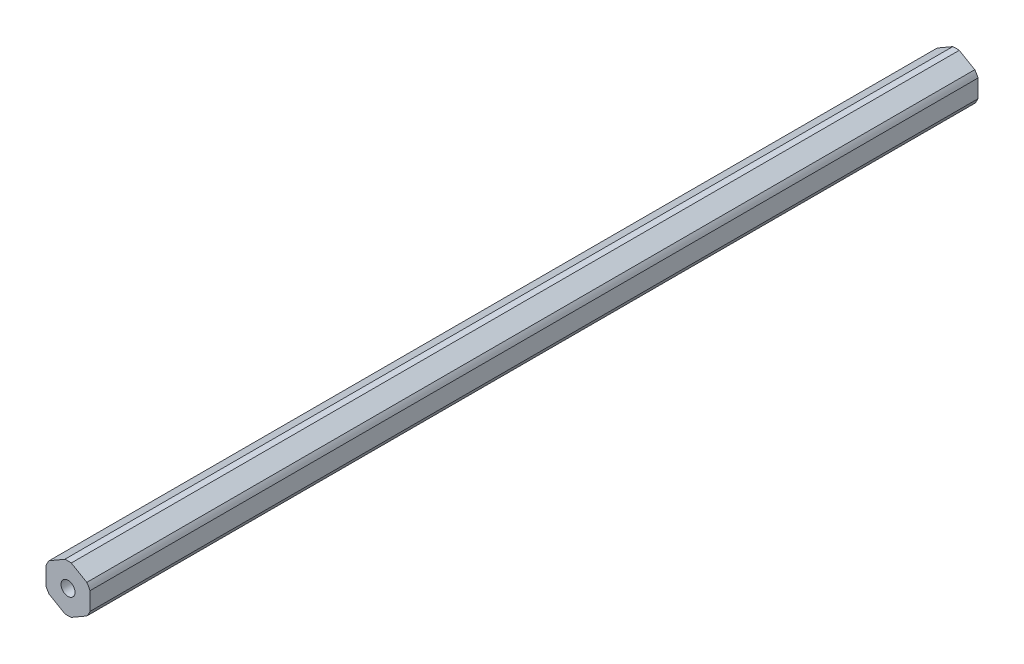
ISO-10303-21;
HEADER;
FILE_DESCRIPTION(('STEP AP214'),'2;1');
FILE_NAME('part.step','',(''),(''),'','','');
FILE_SCHEMA(('AUTOMOTIVE_DESIGN { 1 0 10303 214 1 1 1 1 }'));
ENDSEC;
DATA;
#1=APPLICATION_CONTEXT('core data for automotive mechanical design processes');
#2=APPLICATION_PROTOCOL_DEFINITION('international standard','automotive_design',2000,#1);
#3=PRODUCT_CONTEXT('',#1,'mechanical');
#4=PRODUCT('Part','Part','',(#3));
#5=PRODUCT_RELATED_PRODUCT_CATEGORY('part','',(#4));
#6=PRODUCT_DEFINITION_FORMATION('','',#4);
#7=PRODUCT_DEFINITION_CONTEXT('part definition',#1,'design');
#8=PRODUCT_DEFINITION('design','',#6,#7);
#9=PRODUCT_DEFINITION_SHAPE('','',#8);
#10=(LENGTH_UNIT() NAMED_UNIT(*) SI_UNIT(.MILLI.,.METRE.));
#11=(NAMED_UNIT(*) PLANE_ANGLE_UNIT() SI_UNIT($,.RADIAN.));
#12=(NAMED_UNIT(*) SI_UNIT($,.STERADIAN.) SOLID_ANGLE_UNIT());
#13=UNCERTAINTY_MEASURE_WITH_UNIT(LENGTH_MEASURE(1.E-05),#10,'distance_accuracy_value','');
#14=(GEOMETRIC_REPRESENTATION_CONTEXT(3) GLOBAL_UNCERTAINTY_ASSIGNED_CONTEXT((#13)) GLOBAL_UNIT_ASSIGNED_CONTEXT((#10,
#11,#12)) REPRESENTATION_CONTEXT('',''));
#15=CARTESIAN_POINT('',(0.,0.,0.));
#16=DIRECTION('',(0.,0.,1.));
#17=DIRECTION('',(1.,0.,0.));
#18=AXIS2_PLACEMENT_3D('',#15,#16,#17);
#19=CARTESIAN_POINT('',(6.35,0.,128.0795));
#20=DIRECTION('',(-1.,0.,0.));
#21=DIRECTION('',(0.,-1.,0.));
#22=AXIS2_PLACEMENT_3D('',#19,#20,#21);
#23=PLANE('',#22);
#24=DIRECTION('',(0.,1.,0.));
#25=VECTOR('',#24,1.);
#26=CARTESIAN_POINT('',(6.35,0.,-128.0795));
#27=LINE('',#26,#25);
#28=CARTESIAN_POINT('',(6.35,-2.59030191290513,-128.0795));
#29=VERTEX_POINT('',#28);
#30=CARTESIAN_POINT('',(6.35,2.59030191290513,-128.0795));
#31=VERTEX_POINT('',#30);
#32=EDGE_CURVE('E173',#29,#31,#27,.T.);
#33=ORIENTED_EDGE('',*,*,#32,.T.);
#34=DIRECTION('',(0.,0.,-1.));
#35=VECTOR('',#34,1.);
#36=CARTESIAN_POINT('',(6.35,2.59030191290513,128.0795));
#37=LINE('',#36,#35);
#38=CARTESIAN_POINT('',(6.35,2.59030191290513,128.0795));
#39=VERTEX_POINT('',#38);
#40=EDGE_CURVE('E11',#39,#31,#37,.T.);
#41=ORIENTED_EDGE('',*,*,#40,.F.);
#42=DIRECTION('',(0.,1.,0.));
#43=VECTOR('',#42,1.);
#44=CARTESIAN_POINT('',(6.35,0.,128.0795));
#45=LINE('',#44,#43);
#46=CARTESIAN_POINT('',(6.35,-2.59030191290513,128.0795));
#47=VERTEX_POINT('',#46);
#48=EDGE_CURVE('E253',#47,#39,#45,.T.);
#49=ORIENTED_EDGE('',*,*,#48,.F.);
#50=DIRECTION('',(0.,0.,-1.));
#51=VECTOR('',#50,1.);
#52=CARTESIAN_POINT('',(6.35,-2.59030191290513,128.0795));
#53=LINE('',#52,#51);
#54=EDGE_CURVE('E169',#47,#29,#53,.T.);
#55=ORIENTED_EDGE('',*,*,#54,.T.);
#56=EDGE_LOOP('',(#33,#41,#49,#55));
#57=FACE_BOUND('',#56,.T.);
#58=ADVANCED_FACE('F47',(#57),#23,.F.);
#59=CARTESIAN_POINT('',(0.,0.,128.0795));
#60=DIRECTION('',(0.,0.,-1.));
#61=DIRECTION('',(-1.,0.,0.));
#62=AXIS2_PLACEMENT_3D('',#59,#60,#61);
#63=CYLINDRICAL_SURFACE('',#62,6.858);
#64=CARTESIAN_POINT('',(0.,0.,-128.0795));
#65=DIRECTION('',(0.,0.,1.));
#66=DIRECTION('',(1.,0.,0.));
#67=AXIS2_PLACEMENT_3D('',#64,#65,#66);
#68=CIRCLE('',#67,6.858);
#69=CARTESIAN_POINT('',(5.41826726004727,4.20411035757862,-128.0795));
#70=VERTEX_POINT('',#69);
#71=EDGE_CURVE('E177',#31,#70,#68,.T.);
#72=ORIENTED_EDGE('',*,*,#71,.T.);
#73=DIRECTION('',(0.,0.,-1.));
#74=VECTOR('',#73,1.);
#75=CARTESIAN_POINT('',(5.41826726004727,4.20411035757862,128.0795));
#76=LINE('',#75,#74);
#77=CARTESIAN_POINT('',(5.41826726004727,4.20411035757862,128.0795));
#78=VERTEX_POINT('',#77);
#79=EDGE_CURVE('E56',#78,#70,#76,.T.);
#80=ORIENTED_EDGE('',*,*,#79,.F.);
#81=CARTESIAN_POINT('',(0.,0.,128.0795));
#82=DIRECTION('',(0.,0.,1.));
#83=DIRECTION('',(1.,0.,0.));
#84=AXIS2_PLACEMENT_3D('',#81,#82,#83);
#85=CIRCLE('',#84,6.858);
#86=EDGE_CURVE('E119',#39,#78,#85,.T.);
#87=ORIENTED_EDGE('',*,*,#86,.F.);
#88=ORIENTED_EDGE('',*,*,#40,.T.);
#89=EDGE_LOOP('',(#72,#80,#87,#88));
#90=FACE_BOUND('',#89,.T.);
#91=ADVANCED_FACE('F297',(#90),#63,.T.);
#92=CARTESIAN_POINT('',(3.175,5.49926131403119,128.0795));
#93=DIRECTION('',(-0.5,-0.866025403784439,0.));
#94=DIRECTION('',(0.866025403784439,-0.5,0.));
#95=AXIS2_PLACEMENT_3D('',#92,#93,#94);
#96=PLANE('',#95);
#97=DIRECTION('',(-0.866025403784439,0.5,0.));
#98=VECTOR('',#97,1.);
#99=CARTESIAN_POINT('',(3.175,5.49926131403119,-128.0795));
#100=LINE('',#99,#98);
#101=CARTESIAN_POINT('',(0.931732739952728,6.79441227048375,-128.0795));
#102=VERTEX_POINT('',#101);
#103=EDGE_CURVE('E181',#70,#102,#100,.T.);
#104=ORIENTED_EDGE('',*,*,#103,.T.);
#105=DIRECTION('',(0.,0.,-1.));
#106=VECTOR('',#105,1.);
#107=CARTESIAN_POINT('',(0.931732739952728,6.79441227048375,128.0795));
#108=LINE('',#107,#106);
#109=CARTESIAN_POINT('',(0.931732739952728,6.79441227048375,128.0795));
#110=VERTEX_POINT('',#109);
#111=EDGE_CURVE('E224',#110,#102,#108,.T.);
#112=ORIENTED_EDGE('',*,*,#111,.F.);
#113=DIRECTION('',(-0.866025403784439,0.5,0.));
#114=VECTOR('',#113,1.);
#115=CARTESIAN_POINT('',(3.175,5.49926131403119,128.0795));
#116=LINE('',#115,#114);
#117=EDGE_CURVE('E234',#78,#110,#116,.T.);
#118=ORIENTED_EDGE('',*,*,#117,.F.);
#119=ORIENTED_EDGE('',*,*,#79,.T.);
#120=EDGE_LOOP('',(#104,#112,#118,#119));
#121=FACE_BOUND('',#120,.T.);
#122=ADVANCED_FACE('F232',(#121),#96,.F.);
#123=CARTESIAN_POINT('',(-0.931732739952723,6.79441227048375,-128.0795));
#124=VERTEX_POINT('',#123);
#125=EDGE_CURVE('E182',#102,#124,#68,.T.);
#126=ORIENTED_EDGE('',*,*,#125,.T.);
#127=DIRECTION('',(0.,0.,-1.));
#128=VECTOR('',#127,1.);
#129=CARTESIAN_POINT('',(-0.931732739952723,6.79441227048375,128.0795));
#130=LINE('',#129,#128);
#131=CARTESIAN_POINT('',(-0.931732739952723,6.79441227048375,128.0795));
#132=VERTEX_POINT('',#131);
#133=EDGE_CURVE('E220',#132,#124,#130,.T.);
#134=ORIENTED_EDGE('',*,*,#133,.F.);
#135=EDGE_CURVE('E259',#110,#132,#85,.T.);
#136=ORIENTED_EDGE('',*,*,#135,.F.);
#137=ORIENTED_EDGE('',*,*,#111,.T.);
#138=EDGE_LOOP('',(#126,#134,#136,#137));
#139=FACE_BOUND('',#138,.T.);
#140=ADVANCED_FACE('F280',(#139),#63,.T.);
#141=CARTESIAN_POINT('',(-3.175,5.49926131403118,128.0795));
#142=DIRECTION('',(0.5,-0.866025403784438,0.));
#143=DIRECTION('',(0.866025403784439,0.5,0.));
#144=AXIS2_PLACEMENT_3D('',#141,#142,#143);
#145=PLANE('',#144);
#146=DIRECTION('',(-0.866025403784439,-0.5,0.));
#147=VECTOR('',#146,1.);
#148=CARTESIAN_POINT('',(-3.175,5.49926131403118,-128.0795));
#149=LINE('',#148,#147);
#150=CARTESIAN_POINT('',(-5.41826726004728,4.20411035757861,-128.0795));
#151=VERTEX_POINT('',#150);
#152=EDGE_CURVE('E185',#124,#151,#149,.T.);
#153=ORIENTED_EDGE('',*,*,#152,.T.);
#154=DIRECTION('',(0.,0.,-1.));
#155=VECTOR('',#154,1.);
#156=CARTESIAN_POINT('',(-5.41826726004728,4.20411035757861,128.0795));
#157=LINE('',#156,#155);
#158=CARTESIAN_POINT('',(-5.41826726004728,4.20411035757861,128.0795));
#159=VERTEX_POINT('',#158);
#160=EDGE_CURVE('E216',#159,#151,#157,.T.);
#161=ORIENTED_EDGE('',*,*,#160,.F.);
#162=DIRECTION('',(-0.866025403784439,-0.5,0.));
#163=VECTOR('',#162,1.);
#164=CARTESIAN_POINT('',(-3.175,5.49926131403118,128.0795));
#165=LINE('',#164,#163);
#166=EDGE_CURVE('E266',#132,#159,#165,.T.);
#167=ORIENTED_EDGE('',*,*,#166,.F.);
#168=ORIENTED_EDGE('',*,*,#133,.T.);
#169=EDGE_LOOP('',(#153,#161,#167,#168));
#170=FACE_BOUND('',#169,.T.);
#171=ADVANCED_FACE('F282',(#170),#145,.F.);
#172=CARTESIAN_POINT('',(-6.35,2.59030191290514,-128.0795));
#173=VERTEX_POINT('',#172);
#174=EDGE_CURVE('E188',#151,#173,#68,.T.);
#175=ORIENTED_EDGE('',*,*,#174,.T.);
#176=DIRECTION('',(0.,0.,-1.));
#177=VECTOR('',#176,1.);
#178=CARTESIAN_POINT('',(-6.35,2.59030191290514,128.0795));
#179=LINE('',#178,#177);
#180=CARTESIAN_POINT('',(-6.35,2.59030191290514,128.0795));
#181=VERTEX_POINT('',#180);
#182=EDGE_CURVE('E212',#181,#173,#179,.T.);
#183=ORIENTED_EDGE('',*,*,#182,.F.);
#184=EDGE_CURVE('E268',#159,#181,#85,.T.);
#185=ORIENTED_EDGE('',*,*,#184,.F.);
#186=ORIENTED_EDGE('',*,*,#160,.T.);
#187=EDGE_LOOP('',(#175,#183,#185,#186));
#188=FACE_BOUND('',#187,.T.);
#189=ADVANCED_FACE('F283',(#188),#63,.T.);
#190=CARTESIAN_POINT('',(-6.35,0.,128.0795));
#191=DIRECTION('',(1.,0.,0.));
#192=DIRECTION('',(0.,1.,0.));
#193=AXIS2_PLACEMENT_3D('',#190,#191,#192);
#194=PLANE('',#193);
#195=DIRECTION('',(0.,-1.,0.));
#196=VECTOR('',#195,1.);
#197=CARTESIAN_POINT('',(-6.35,0.,-128.0795));
#198=LINE('',#197,#196);
#199=CARTESIAN_POINT('',(-6.35,-2.59030191290514,-128.0795));
#200=VERTEX_POINT('',#199);
#201=EDGE_CURVE('E189',#173,#200,#198,.T.);
#202=ORIENTED_EDGE('',*,*,#201,.T.);
#203=DIRECTION('',(0.,0.,-1.));
#204=VECTOR('',#203,1.);
#205=CARTESIAN_POINT('',(-6.35,-2.59030191290514,128.0795));
#206=LINE('',#205,#204);
#207=CARTESIAN_POINT('',(-6.35,-2.59030191290514,128.0795));
#208=VERTEX_POINT('',#207);
#209=EDGE_CURVE('E208',#208,#200,#206,.T.);
#210=ORIENTED_EDGE('',*,*,#209,.F.);
#211=DIRECTION('',(0.,-1.,0.));
#212=VECTOR('',#211,1.);
#213=CARTESIAN_POINT('',(-6.35,0.,128.0795));
#214=LINE('',#213,#212);
#215=EDGE_CURVE('E269',#181,#208,#214,.T.);
#216=ORIENTED_EDGE('',*,*,#215,.F.);
#217=ORIENTED_EDGE('',*,*,#182,.T.);
#218=EDGE_LOOP('',(#202,#210,#216,#217));
#219=FACE_BOUND('',#218,.T.);
#220=ADVANCED_FACE('F286',(#219),#194,.F.);
#221=CARTESIAN_POINT('',(-5.41826726004728,-4.20411035757862,-128.0795));
#222=VERTEX_POINT('',#221);
#223=EDGE_CURVE('E192',#200,#222,#68,.T.);
#224=ORIENTED_EDGE('',*,*,#223,.T.);
#225=DIRECTION('',(0.,0.,-1.));
#226=VECTOR('',#225,1.);
#227=CARTESIAN_POINT('',(-5.41826726004728,-4.20411035757862,128.0795));
#228=LINE('',#227,#226);
#229=CARTESIAN_POINT('',(-5.41826726004728,-4.20411035757862,128.0795));
#230=VERTEX_POINT('',#229);
#231=EDGE_CURVE('E204',#230,#222,#228,.T.);
#232=ORIENTED_EDGE('',*,*,#231,.F.);
#233=EDGE_CURVE('E156',#208,#230,#85,.T.);
#234=ORIENTED_EDGE('',*,*,#233,.F.);
#235=ORIENTED_EDGE('',*,*,#209,.T.);
#236=EDGE_LOOP('',(#224,#232,#234,#235));
#237=FACE_BOUND('',#236,.T.);
#238=ADVANCED_FACE('F288',(#237),#63,.T.);
#239=CARTESIAN_POINT('',(-3.175,-5.49926131403118,128.0795));
#240=DIRECTION('',(0.5,0.866025403784438,0.));
#241=DIRECTION('',(-0.866025403784439,0.5,0.));
#242=AXIS2_PLACEMENT_3D('',#239,#240,#241);
#243=PLANE('',#242);
#244=DIRECTION('',(0.866025403784439,-0.5,0.));
#245=VECTOR('',#244,1.);
#246=CARTESIAN_POINT('',(-3.175,-5.49926131403118,-128.0795));
#247=LINE('',#246,#245);
#248=CARTESIAN_POINT('',(-0.931732739952726,-6.79441227048375,-128.0795));
#249=VERTEX_POINT('',#248);
#250=EDGE_CURVE('E193',#222,#249,#247,.T.);
#251=ORIENTED_EDGE('',*,*,#250,.T.);
#252=DIRECTION('',(0.,0.,-1.));
#253=VECTOR('',#252,1.);
#254=CARTESIAN_POINT('',(-0.931732739952726,-6.79441227048375,128.0795));
#255=LINE('',#254,#253);
#256=CARTESIAN_POINT('',(-0.931732739952726,-6.79441227048375,128.0795));
#257=VERTEX_POINT('',#256);
#258=EDGE_CURVE('E162',#257,#249,#255,.T.);
#259=ORIENTED_EDGE('',*,*,#258,.F.);
#260=DIRECTION('',(0.866025403784439,-0.5,0.));
#261=VECTOR('',#260,1.);
#262=CARTESIAN_POINT('',(-3.175,-5.49926131403118,128.0795));
#263=LINE('',#262,#261);
#264=EDGE_CURVE('E150',#230,#257,#263,.T.);
#265=ORIENTED_EDGE('',*,*,#264,.F.);
#266=ORIENTED_EDGE('',*,*,#231,.T.);
#267=EDGE_LOOP('',(#251,#259,#265,#266));
#268=FACE_BOUND('',#267,.T.);
#269=ADVANCED_FACE('F291',(#268),#243,.F.);
#270=CARTESIAN_POINT('',(0.931732739952723,-6.79441227048375,-128.0795));
#271=VERTEX_POINT('',#270);
#272=EDGE_CURVE('E160',#249,#271,#68,.T.);
#273=ORIENTED_EDGE('',*,*,#272,.T.);
#274=DIRECTION('',(0.,0.,-1.));
#275=VECTOR('',#274,1.);
#276=CARTESIAN_POINT('',(0.931732739952723,-6.79441227048375,128.0795));
#277=LINE('',#276,#275);
#278=CARTESIAN_POINT('',(0.931732739952723,-6.79441227048375,128.0795));
#279=VERTEX_POINT('',#278);
#280=EDGE_CURVE('E157',#279,#271,#277,.T.);
#281=ORIENTED_EDGE('',*,*,#280,.F.);
#282=EDGE_CURVE('E144',#257,#279,#85,.T.);
#283=ORIENTED_EDGE('',*,*,#282,.F.);
#284=ORIENTED_EDGE('',*,*,#258,.T.);
#285=EDGE_LOOP('',(#273,#281,#283,#284));
#286=FACE_BOUND('',#285,.T.);
#287=ADVANCED_FACE('F158',(#286),#63,.T.);
#288=CARTESIAN_POINT('',(3.175,-5.49926131403119,128.0795));
#289=DIRECTION('',(-0.5,0.866025403784439,0.));
#290=DIRECTION('',(-0.866025403784439,-0.5,0.));
#291=AXIS2_PLACEMENT_3D('',#288,#289,#290);
#292=PLANE('',#291);
#293=DIRECTION('',(0.866025403784439,0.5,0.));
#294=VECTOR('',#293,1.);
#295=CARTESIAN_POINT('',(3.175,-5.49926131403119,-128.0795));
#296=LINE('',#295,#294);
#297=CARTESIAN_POINT('',(5.41826726004727,-4.20411035757862,-128.0795));
#298=VERTEX_POINT('',#297);
#299=EDGE_CURVE('E105',#271,#298,#296,.T.);
#300=ORIENTED_EDGE('',*,*,#299,.T.);
#301=DIRECTION('',(0.,0.,-1.));
#302=VECTOR('',#301,1.);
#303=CARTESIAN_POINT('',(5.41826726004727,-4.20411035757862,128.0795));
#304=LINE('',#303,#302);
#305=CARTESIAN_POINT('',(5.41826726004727,-4.20411035757862,128.0795));
#306=VERTEX_POINT('',#305);
#307=EDGE_CURVE('E163',#306,#298,#304,.T.);
#308=ORIENTED_EDGE('',*,*,#307,.F.);
#309=DIRECTION('',(0.866025403784439,0.5,0.));
#310=VECTOR('',#309,1.);
#311=CARTESIAN_POINT('',(3.175,-5.49926131403119,128.0795));
#312=LINE('',#311,#310);
#313=EDGE_CURVE('E148',#279,#306,#312,.T.);
#314=ORIENTED_EDGE('',*,*,#313,.F.);
#315=ORIENTED_EDGE('',*,*,#280,.T.);
#316=EDGE_LOOP('',(#300,#308,#314,#315));
#317=FACE_BOUND('',#316,.T.);
#318=ADVANCED_FACE('F165',(#317),#292,.F.);
#319=EDGE_CURVE('E111',#298,#29,#68,.T.);
#320=ORIENTED_EDGE('',*,*,#319,.T.);
#321=ORIENTED_EDGE('',*,*,#54,.F.);
#322=EDGE_CURVE('E64',#306,#47,#85,.T.);
#323=ORIENTED_EDGE('',*,*,#322,.F.);
#324=ORIENTED_EDGE('',*,*,#307,.T.);
#325=EDGE_LOOP('',(#320,#321,#323,#324));
#326=FACE_BOUND('',#325,.T.);
#327=ADVANCED_FACE('F294',(#326),#63,.T.);
#328=CARTESIAN_POINT('',(0.,0.,128.0795));
#329=DIRECTION('',(0.,0.,1.));
#330=DIRECTION('',(1.,0.,0.));
#331=AXIS2_PLACEMENT_3D('',#328,#329,#330);
#332=PLANE('',#331);
#333=CARTESIAN_POINT('',(0.,0.,128.0795));
#334=DIRECTION('',(0.,0.,1.));
#335=DIRECTION('',(1.,0.,0.));
#336=AXIS2_PLACEMENT_3D('',#333,#334,#335);
#337=CIRCLE('',#336,2.0193);
#338=CARTESIAN_POINT('',(2.0193,0.,128.0795));
#339=VERTEX_POINT('',#338);
#340=EDGE_CURVE('E261',#339,#339,#337,.T.);
#341=ORIENTED_EDGE('',*,*,#340,.F.);
#342=EDGE_LOOP('',(#341));
#343=FACE_BOUND('',#342,.T.);
#344=ORIENTED_EDGE('',*,*,#48,.T.);
#345=ORIENTED_EDGE('',*,*,#86,.T.);
#346=ORIENTED_EDGE('',*,*,#117,.T.);
#347=ORIENTED_EDGE('',*,*,#135,.T.);
#348=ORIENTED_EDGE('',*,*,#166,.T.);
#349=ORIENTED_EDGE('',*,*,#184,.T.);
#350=ORIENTED_EDGE('',*,*,#215,.T.);
#351=ORIENTED_EDGE('',*,*,#233,.T.);
#352=ORIENTED_EDGE('',*,*,#264,.T.);
#353=ORIENTED_EDGE('',*,*,#282,.T.);
#354=ORIENTED_EDGE('',*,*,#313,.T.);
#355=ORIENTED_EDGE('',*,*,#322,.T.);
#356=EDGE_LOOP('',(#344,#345,#346,#347,#348,#349,#350,#351,#352,#353,#354,#355));
#357=FACE_BOUND('',#356,.T.);
#358=ADVANCED_FACE('F146',(#343,#357),#332,.T.);
#359=CARTESIAN_POINT('',(0.,0.,-128.0795));
#360=DIRECTION('',(0.,0.,1.));
#361=DIRECTION('',(1.,0.,0.));
#362=AXIS2_PLACEMENT_3D('',#359,#360,#361);
#363=PLANE('',#362);
#364=CARTESIAN_POINT('',(0.,0.,-128.0795));
#365=DIRECTION('',(0.,0.,1.));
#366=DIRECTION('',(1.,0.,0.));
#367=AXIS2_PLACEMENT_3D('',#364,#365,#366);
#368=CIRCLE('',#367,2.0193);
#369=CARTESIAN_POINT('',(2.0193,0.,-128.0795));
#370=VERTEX_POINT('',#369);
#371=EDGE_CURVE('E178',#370,#370,#368,.T.);
#372=ORIENTED_EDGE('',*,*,#371,.T.);
#373=EDGE_LOOP('',(#372));
#374=FACE_BOUND('',#373,.T.);
#375=ORIENTED_EDGE('',*,*,#32,.F.);
#376=ORIENTED_EDGE('',*,*,#319,.F.);
#377=ORIENTED_EDGE('',*,*,#299,.F.);
#378=ORIENTED_EDGE('',*,*,#272,.F.);
#379=ORIENTED_EDGE('',*,*,#250,.F.);
#380=ORIENTED_EDGE('',*,*,#223,.F.);
#381=ORIENTED_EDGE('',*,*,#201,.F.);
#382=ORIENTED_EDGE('',*,*,#174,.F.);
#383=ORIENTED_EDGE('',*,*,#152,.F.);
#384=ORIENTED_EDGE('',*,*,#125,.F.);
#385=ORIENTED_EDGE('',*,*,#103,.F.);
#386=ORIENTED_EDGE('',*,*,#71,.F.);
#387=EDGE_LOOP('',(#375,#376,#377,#378,#379,#380,#381,#382,#383,#384,#385,#386));
#388=FACE_BOUND('',#387,.T.);
#389=ADVANCED_FACE('F238',(#374,#388),#363,.F.);
#390=CARTESIAN_POINT('',(0.,0.,-128.0795));
#391=DIRECTION('',(0.,0.,1.));
#392=DIRECTION('',(1.,0.,0.));
#393=AXIS2_PLACEMENT_3D('',#390,#391,#392);
#394=CYLINDRICAL_SURFACE('',#393,2.0193);
#395=ORIENTED_EDGE('',*,*,#371,.F.);
#396=EDGE_LOOP('',(#395));
#397=FACE_BOUND('',#396,.T.);
#398=ORIENTED_EDGE('',*,*,#340,.T.);
#399=EDGE_LOOP('',(#398));
#400=FACE_BOUND('',#399,.T.);
#401=ADVANCED_FACE('F391',(#397,#400),#394,.F.);
#402=CLOSED_SHELL('',(#58,#91,#122,#140,#171,#189,#220,#238,#269,#287,#318,#327,#358,#389,#401));
#403=MANIFOLD_SOLID_BREP('B2',#402);
#404=ADVANCED_BREP_SHAPE_REPRESENTATION('',(#18,#403),#14);
#405=SHAPE_DEFINITION_REPRESENTATION(#9,#404);
ENDSEC;
END-ISO-10303-21;
